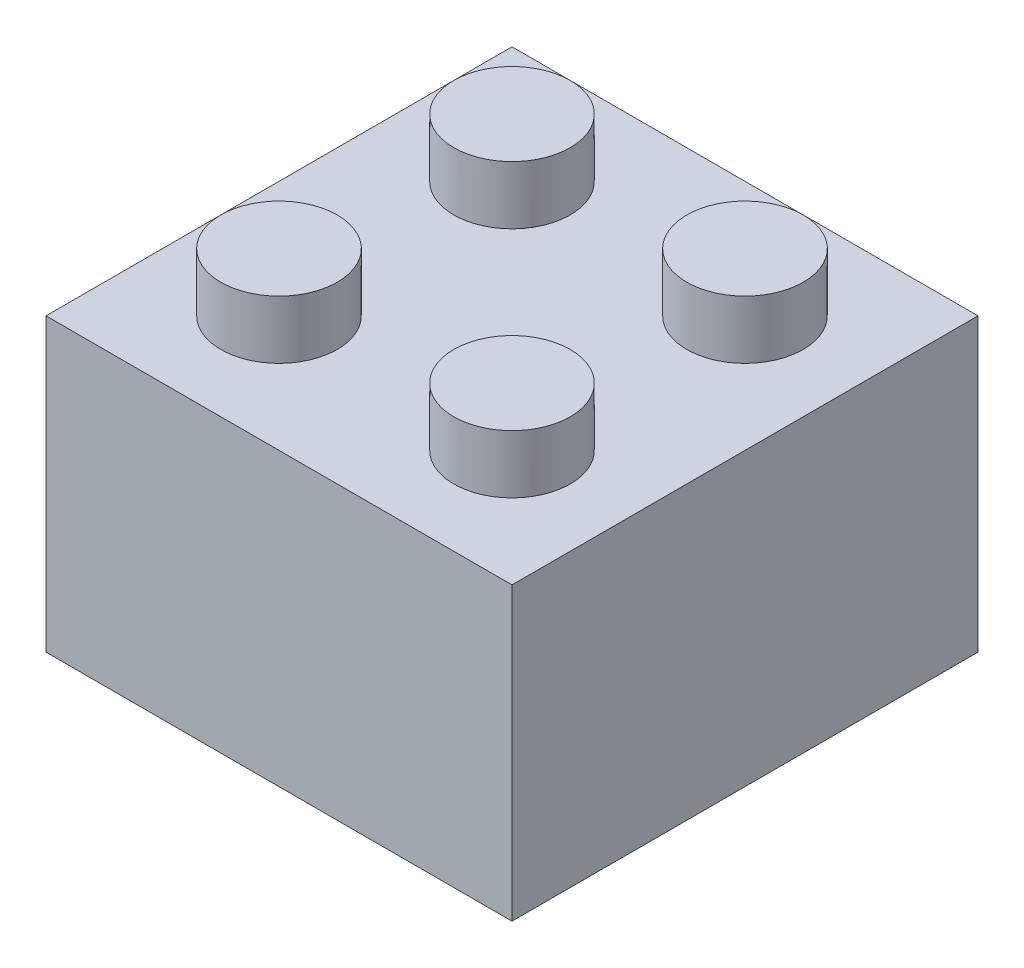
ISO-10303-21;
HEADER;
FILE_DESCRIPTION(('STEP AP214'),'2;1');
FILE_NAME('part.step','',(''),(''),'','','');
FILE_SCHEMA(('AUTOMOTIVE_DESIGN { 1 0 10303 214 1 1 1 1 }'));
ENDSEC;
DATA;
#1=APPLICATION_CONTEXT('core data for automotive mechanical design processes');
#2=APPLICATION_PROTOCOL_DEFINITION('international standard','automotive_design',2000,#1);
#3=PRODUCT_CONTEXT('',#1,'mechanical');
#4=PRODUCT('Part','Part','',(#3));
#5=PRODUCT_RELATED_PRODUCT_CATEGORY('part','',(#4));
#6=PRODUCT_DEFINITION_FORMATION('','',#4);
#7=PRODUCT_DEFINITION_CONTEXT('part definition',#1,'design');
#8=PRODUCT_DEFINITION('design','',#6,#7);
#9=PRODUCT_DEFINITION_SHAPE('','',#8);
#10=(LENGTH_UNIT() NAMED_UNIT(*) SI_UNIT(.MILLI.,.METRE.));
#11=(NAMED_UNIT(*) PLANE_ANGLE_UNIT() SI_UNIT($,.RADIAN.));
#12=(NAMED_UNIT(*) SI_UNIT($,.STERADIAN.) SOLID_ANGLE_UNIT());
#13=UNCERTAINTY_MEASURE_WITH_UNIT(LENGTH_MEASURE(1.E-05),#10,'distance_accuracy_value','');
#14=(GEOMETRIC_REPRESENTATION_CONTEXT(3) GLOBAL_UNCERTAINTY_ASSIGNED_CONTEXT((#13)) GLOBAL_UNIT_ASSIGNED_CONTEXT((#10,
#11,#12)) REPRESENTATION_CONTEXT('',''));
#15=CARTESIAN_POINT('',(0.,0.,0.));
#16=DIRECTION('',(0.,0.,1.));
#17=DIRECTION('',(1.,0.,0.));
#18=AXIS2_PLACEMENT_3D('',#15,#16,#17);
#19=CARTESIAN_POINT('',(0.,0.,0.));
#20=DIRECTION('',(0.,-1.,0.));
#21=DIRECTION('',(0.,0.,-1.));
#22=AXIS2_PLACEMENT_3D('',#19,#20,#21);
#23=PLANE('',#22);
#24=DIRECTION('',(0.,0.,1.));
#25=VECTOR('',#24,1.);
#26=CARTESIAN_POINT('',(0.,0.,0.));
#27=LINE('',#26,#25);
#28=CARTESIAN_POINT('',(0.,0.,-16.));
#29=VERTEX_POINT('',#28);
#30=CARTESIAN_POINT('',(0.,0.,0.));
#31=VERTEX_POINT('',#30);
#32=EDGE_CURVE('E226',#29,#31,#27,.T.);
#33=ORIENTED_EDGE('',*,*,#32,.F.);
#34=DIRECTION('',(-1.,0.,0.));
#35=VECTOR('',#34,1.);
#36=CARTESIAN_POINT('',(0.,0.,-16.));
#37=LINE('',#36,#35);
#38=CARTESIAN_POINT('',(16.,0.,-16.));
#39=VERTEX_POINT('',#38);
#40=EDGE_CURVE('E93',#39,#29,#37,.T.);
#41=ORIENTED_EDGE('',*,*,#40,.F.);
#42=DIRECTION('',(0.,0.,-1.));
#43=VECTOR('',#42,1.);
#44=CARTESIAN_POINT('',(16.,0.,0.));
#45=LINE('',#44,#43);
#46=CARTESIAN_POINT('',(16.,0.,0.));
#47=VERTEX_POINT('',#46);
#48=EDGE_CURVE('E244',#47,#39,#45,.T.);
#49=ORIENTED_EDGE('',*,*,#48,.F.);
#50=DIRECTION('',(1.,0.,0.));
#51=VECTOR('',#50,1.);
#52=CARTESIAN_POINT('',(0.,0.,0.));
#53=LINE('',#52,#51);
#54=EDGE_CURVE('E241',#31,#47,#53,.T.);
#55=ORIENTED_EDGE('',*,*,#54,.F.);
#56=EDGE_LOOP('',(#33,#41,#49,#55));
#57=FACE_BOUND('',#56,.T.);
#58=DIRECTION('',(-1.,0.,0.));
#59=VECTOR('',#58,1.);
#60=CARTESIAN_POINT('',(0.,0.,-15.));
#61=LINE('',#60,#59);
#62=CARTESIAN_POINT('',(15.,0.,-15.));
#63=VERTEX_POINT('',#62);
#64=CARTESIAN_POINT('',(1.00000000000001,0.,-15.));
#65=VERTEX_POINT('',#64);
#66=EDGE_CURVE('E143',#63,#65,#61,.T.);
#67=ORIENTED_EDGE('',*,*,#66,.T.);
#68=DIRECTION('',(0.,0.,1.));
#69=VECTOR('',#68,1.);
#70=CARTESIAN_POINT('',(1.,0.,0.));
#71=LINE('',#70,#69);
#72=CARTESIAN_POINT('',(1.,0.,-1.));
#73=VERTEX_POINT('',#72);
#74=EDGE_CURVE('E188',#65,#73,#71,.T.);
#75=ORIENTED_EDGE('',*,*,#74,.T.);
#76=DIRECTION('',(1.,0.,0.));
#77=VECTOR('',#76,1.);
#78=CARTESIAN_POINT('',(0.,0.,-1.));
#79=LINE('',#78,#77);
#80=CARTESIAN_POINT('',(15.,0.,-1.));
#81=VERTEX_POINT('',#80);
#82=EDGE_CURVE('E147',#73,#81,#79,.T.);
#83=ORIENTED_EDGE('',*,*,#82,.T.);
#84=DIRECTION('',(0.,0.,-1.));
#85=VECTOR('',#84,1.);
#86=CARTESIAN_POINT('',(15.,0.,0.));
#87=LINE('',#86,#85);
#88=EDGE_CURVE('E63',#81,#63,#87,.T.);
#89=ORIENTED_EDGE('',*,*,#88,.T.);
#90=EDGE_LOOP('',(#67,#75,#83,#89));
#91=FACE_BOUND('',#90,.T.);
#92=ADVANCED_FACE('F47',(#57,#91),#23,.T.);
#93=CARTESIAN_POINT('',(0.,10.,0.));
#94=DIRECTION('',(1.,0.,0.));
#95=DIRECTION('',(0.,0.,-1.));
#96=AXIS2_PLACEMENT_3D('',#93,#94,#95);
#97=PLANE('',#96);
#98=ORIENTED_EDGE('',*,*,#32,.T.);
#99=DIRECTION('',(0.,-1.,0.));
#100=VECTOR('',#99,1.);
#101=CARTESIAN_POINT('',(0.,10.,0.));
#102=LINE('',#101,#100);
#103=CARTESIAN_POINT('',(0.,10.,0.));
#104=VERTEX_POINT('',#103);
#105=EDGE_CURVE('E258',#104,#31,#102,.T.);
#106=ORIENTED_EDGE('',*,*,#105,.F.);
#107=DIRECTION('',(0.,0.,1.));
#108=VECTOR('',#107,1.);
#109=CARTESIAN_POINT('',(0.,10.,0.));
#110=LINE('',#109,#108);
#111=CARTESIAN_POINT('',(0.,10.,-16.));
#112=VERTEX_POINT('',#111);
#113=EDGE_CURVE('E227',#112,#104,#110,.T.);
#114=ORIENTED_EDGE('',*,*,#113,.F.);
#115=DIRECTION('',(0.,-1.,0.));
#116=VECTOR('',#115,1.);
#117=CARTESIAN_POINT('',(0.,10.,-16.));
#118=LINE('',#117,#116);
#119=EDGE_CURVE('E237',#112,#29,#118,.T.);
#120=ORIENTED_EDGE('',*,*,#119,.T.);
#121=EDGE_LOOP('',(#98,#106,#114,#120));
#122=FACE_BOUND('',#121,.T.);
#123=ADVANCED_FACE('F49',(#122),#97,.F.);
#124=CARTESIAN_POINT('',(0.,10.,0.));
#125=DIRECTION('',(0.,0.,-1.));
#126=DIRECTION('',(-1.,0.,0.));
#127=AXIS2_PLACEMENT_3D('',#124,#125,#126);
#128=PLANE('',#127);
#129=ORIENTED_EDGE('',*,*,#54,.T.);
#130=DIRECTION('',(0.,-1.,0.));
#131=VECTOR('',#130,1.);
#132=CARTESIAN_POINT('',(16.,10.,0.));
#133=LINE('',#132,#131);
#134=CARTESIAN_POINT('',(16.,10.,0.));
#135=VERTEX_POINT('',#134);
#136=EDGE_CURVE('E254',#135,#47,#133,.T.);
#137=ORIENTED_EDGE('',*,*,#136,.F.);
#138=DIRECTION('',(1.,0.,0.));
#139=VECTOR('',#138,1.);
#140=CARTESIAN_POINT('',(0.,10.,0.));
#141=LINE('',#140,#139);
#142=EDGE_CURVE('E101',#104,#135,#141,.T.);
#143=ORIENTED_EDGE('',*,*,#142,.F.);
#144=ORIENTED_EDGE('',*,*,#105,.T.);
#145=EDGE_LOOP('',(#129,#137,#143,#144));
#146=FACE_BOUND('',#145,.T.);
#147=ADVANCED_FACE('F293',(#146),#128,.F.);
#148=CARTESIAN_POINT('',(16.,10.,0.));
#149=DIRECTION('',(-1.,0.,0.));
#150=DIRECTION('',(0.,0.,1.));
#151=AXIS2_PLACEMENT_3D('',#148,#149,#150);
#152=PLANE('',#151);
#153=ORIENTED_EDGE('',*,*,#48,.T.);
#154=DIRECTION('',(0.,-1.,0.));
#155=VECTOR('',#154,1.);
#156=CARTESIAN_POINT('',(16.,10.,-16.));
#157=LINE('',#156,#155);
#158=CARTESIAN_POINT('',(16.,10.,-16.));
#159=VERTEX_POINT('',#158);
#160=EDGE_CURVE('E251',#159,#39,#157,.T.);
#161=ORIENTED_EDGE('',*,*,#160,.F.);
#162=DIRECTION('',(0.,0.,-1.));
#163=VECTOR('',#162,1.);
#164=CARTESIAN_POINT('',(16.,10.,0.));
#165=LINE('',#164,#163);
#166=EDGE_CURVE('E232',#135,#159,#165,.T.);
#167=ORIENTED_EDGE('',*,*,#166,.F.);
#168=ORIENTED_EDGE('',*,*,#136,.T.);
#169=EDGE_LOOP('',(#153,#161,#167,#168));
#170=FACE_BOUND('',#169,.T.);
#171=ADVANCED_FACE('F298',(#170),#152,.F.);
#172=CARTESIAN_POINT('',(0.,10.,-16.));
#173=DIRECTION('',(0.,0.,1.));
#174=DIRECTION('',(1.,0.,0.));
#175=AXIS2_PLACEMENT_3D('',#172,#173,#174);
#176=PLANE('',#175);
#177=ORIENTED_EDGE('',*,*,#40,.T.);
#178=ORIENTED_EDGE('',*,*,#119,.F.);
#179=DIRECTION('',(-1.,0.,0.));
#180=VECTOR('',#179,1.);
#181=CARTESIAN_POINT('',(0.,10.,-16.));
#182=LINE('',#181,#180);
#183=EDGE_CURVE('E72',#159,#112,#182,.T.);
#184=ORIENTED_EDGE('',*,*,#183,.F.);
#185=ORIENTED_EDGE('',*,*,#160,.T.);
#186=EDGE_LOOP('',(#177,#178,#184,#185));
#187=FACE_BOUND('',#186,.T.);
#188=ADVANCED_FACE('F282',(#187),#176,.F.);
#189=CARTESIAN_POINT('',(0.,10.,0.));
#190=DIRECTION('',(0.,-1.,0.));
#191=DIRECTION('',(0.,0.,-1.));
#192=AXIS2_PLACEMENT_3D('',#189,#190,#191);
#193=PLANE('',#192);
#194=CARTESIAN_POINT('',(4.00000000000001,10.,-4.));
#195=DIRECTION('',(0.,-1.,0.));
#196=DIRECTION('',(0.,0.,-1.));
#197=AXIS2_PLACEMENT_3D('',#194,#195,#196);
#198=CIRCLE('',#197,2.);
#199=CARTESIAN_POINT('',(4.00000000000001,10.,-6.));
#200=VERTEX_POINT('',#199);
#201=EDGE_CURVE('E56',#200,#200,#198,.F.);
#202=ORIENTED_EDGE('',*,*,#201,.F.);
#203=EDGE_LOOP('',(#202));
#204=FACE_BOUND('',#203,.T.);
#205=CARTESIAN_POINT('',(4.00000000000001,10.,-12.));
#206=DIRECTION('',(0.,-1.,0.));
#207=DIRECTION('',(0.,0.,-1.));
#208=AXIS2_PLACEMENT_3D('',#205,#206,#207);
#209=CIRCLE('',#208,2.);
#210=CARTESIAN_POINT('',(4.00000000000001,10.,-14.));
#211=VERTEX_POINT('',#210);
#212=EDGE_CURVE('E269',#211,#211,#209,.F.);
#213=ORIENTED_EDGE('',*,*,#212,.F.);
#214=EDGE_LOOP('',(#213));
#215=FACE_BOUND('',#214,.T.);
#216=CARTESIAN_POINT('',(12.,10.,-4.));
#217=DIRECTION('',(0.,-1.,0.));
#218=DIRECTION('',(0.,0.,-1.));
#219=AXIS2_PLACEMENT_3D('',#216,#217,#218);
#220=CIRCLE('',#219,2.);
#221=CARTESIAN_POINT('',(12.,10.,-6.00000000000001));
#222=VERTEX_POINT('',#221);
#223=EDGE_CURVE('E265',#222,#222,#220,.F.);
#224=ORIENTED_EDGE('',*,*,#223,.F.);
#225=EDGE_LOOP('',(#224));
#226=FACE_BOUND('',#225,.T.);
#227=CARTESIAN_POINT('',(12.,10.,-12.));
#228=DIRECTION('',(0.,-1.,0.));
#229=DIRECTION('',(0.,0.,-1.));
#230=AXIS2_PLACEMENT_3D('',#227,#228,#229);
#231=CIRCLE('',#230,2.);
#232=CARTESIAN_POINT('',(12.,10.,-14.));
#233=VERTEX_POINT('',#232);
#234=EDGE_CURVE('E261',#233,#233,#231,.F.);
#235=ORIENTED_EDGE('',*,*,#234,.F.);
#236=EDGE_LOOP('',(#235));
#237=FACE_BOUND('',#236,.T.);
#238=ORIENTED_EDGE('',*,*,#113,.T.);
#239=ORIENTED_EDGE('',*,*,#142,.T.);
#240=ORIENTED_EDGE('',*,*,#166,.T.);
#241=ORIENTED_EDGE('',*,*,#183,.T.);
#242=EDGE_LOOP('',(#238,#239,#240,#241));
#243=FACE_BOUND('',#242,.T.);
#244=ADVANCED_FACE('F278',(#204,#215,#226,#237,#243),#193,.F.);
#245=CARTESIAN_POINT('',(12.,12.,-12.));
#246=DIRECTION('',(0.,-1.,0.));
#247=DIRECTION('',(0.,0.,-1.));
#248=AXIS2_PLACEMENT_3D('',#245,#246,#247);
#249=CYLINDRICAL_SURFACE('',#248,2.);
#250=CARTESIAN_POINT('',(12.,12.,-12.));
#251=DIRECTION('',(0.,1.,0.));
#252=DIRECTION('',(0.,0.,-1.));
#253=AXIS2_PLACEMENT_3D('',#250,#251,#252);
#254=CIRCLE('',#253,2.);
#255=CARTESIAN_POINT('',(12.,12.,-14.));
#256=VERTEX_POINT('',#255);
#257=EDGE_CURVE('E222',#256,#256,#254,.T.);
#258=ORIENTED_EDGE('',*,*,#257,.F.);
#259=EDGE_LOOP('',(#258));
#260=FACE_BOUND('',#259,.T.);
#261=ORIENTED_EDGE('',*,*,#234,.T.);
#262=EDGE_LOOP('',(#261));
#263=FACE_BOUND('',#262,.T.);
#264=ADVANCED_FACE('F281',(#260,#263),#249,.T.);
#265=CARTESIAN_POINT('',(12.,12.,-12.));
#266=DIRECTION('',(0.,-1.,0.));
#267=DIRECTION('',(0.,0.,-1.));
#268=AXIS2_PLACEMENT_3D('',#265,#266,#267);
#269=PLANE('',#268);
#270=ORIENTED_EDGE('',*,*,#257,.T.);
#271=EDGE_LOOP('',(#270));
#272=FACE_BOUND('',#271,.T.);
#273=ADVANCED_FACE('F374',(#272),#269,.F.);
#274=CARTESIAN_POINT('',(12.,12.,-4.));
#275=DIRECTION('',(0.,-1.,0.));
#276=DIRECTION('',(0.,0.,-1.));
#277=AXIS2_PLACEMENT_3D('',#274,#275,#276);
#278=CYLINDRICAL_SURFACE('',#277,2.);
#279=CARTESIAN_POINT('',(12.,12.,-4.));
#280=DIRECTION('',(0.,1.,0.));
#281=DIRECTION('',(0.,0.,1.));
#282=AXIS2_PLACEMENT_3D('',#279,#280,#281);
#283=CIRCLE('',#282,2.);
#284=CARTESIAN_POINT('',(12.,12.,-2.));
#285=VERTEX_POINT('',#284);
#286=EDGE_CURVE('E218',#285,#285,#283,.T.);
#287=ORIENTED_EDGE('',*,*,#286,.F.);
#288=EDGE_LOOP('',(#287));
#289=FACE_BOUND('',#288,.T.);
#290=ORIENTED_EDGE('',*,*,#223,.T.);
#291=EDGE_LOOP('',(#290));
#292=FACE_BOUND('',#291,.T.);
#293=ADVANCED_FACE('F371',(#289,#292),#278,.T.);
#294=CARTESIAN_POINT('',(12.,12.,-4.));
#295=DIRECTION('',(0.,1.,0.));
#296=DIRECTION('',(0.,0.,1.));
#297=AXIS2_PLACEMENT_3D('',#294,#295,#296);
#298=PLANE('',#297);
#299=ORIENTED_EDGE('',*,*,#286,.T.);
#300=EDGE_LOOP('',(#299));
#301=FACE_BOUND('',#300,.T.);
#302=ADVANCED_FACE('F366',(#301),#298,.T.);
#303=CARTESIAN_POINT('',(4.00000000000001,12.,-12.));
#304=DIRECTION('',(0.,-1.,0.));
#305=DIRECTION('',(0.,0.,-1.));
#306=AXIS2_PLACEMENT_3D('',#303,#304,#305);
#307=CYLINDRICAL_SURFACE('',#306,2.);
#308=CARTESIAN_POINT('',(4.00000000000001,12.,-12.));
#309=DIRECTION('',(0.,1.,0.));
#310=DIRECTION('',(0.,0.,1.));
#311=AXIS2_PLACEMENT_3D('',#308,#309,#310);
#312=CIRCLE('',#311,2.);
#313=CARTESIAN_POINT('',(4.00000000000001,12.,-10.));
#314=VERTEX_POINT('',#313);
#315=EDGE_CURVE('E214',#314,#314,#312,.T.);
#316=ORIENTED_EDGE('',*,*,#315,.F.);
#317=EDGE_LOOP('',(#316));
#318=FACE_BOUND('',#317,.T.);
#319=ORIENTED_EDGE('',*,*,#212,.T.);
#320=EDGE_LOOP('',(#319));
#321=FACE_BOUND('',#320,.T.);
#322=ADVANCED_FACE('F363',(#318,#321),#307,.T.);
#323=CARTESIAN_POINT('',(4.00000000000001,12.,-12.));
#324=DIRECTION('',(0.,1.,0.));
#325=DIRECTION('',(0.,0.,1.));
#326=AXIS2_PLACEMENT_3D('',#323,#324,#325);
#327=PLANE('',#326);
#328=ORIENTED_EDGE('',*,*,#315,.T.);
#329=EDGE_LOOP('',(#328));
#330=FACE_BOUND('',#329,.T.);
#331=ADVANCED_FACE('F358',(#330),#327,.T.);
#332=CARTESIAN_POINT('',(4.00000000000001,12.,-4.));
#333=DIRECTION('',(0.,-1.,0.));
#334=DIRECTION('',(0.,0.,-1.));
#335=AXIS2_PLACEMENT_3D('',#332,#333,#334);
#336=CYLINDRICAL_SURFACE('',#335,2.);
#337=CARTESIAN_POINT('',(4.00000000000001,12.,-4.));
#338=DIRECTION('',(0.,1.,0.));
#339=DIRECTION('',(0.,0.,-1.));
#340=AXIS2_PLACEMENT_3D('',#337,#338,#339);
#341=CIRCLE('',#340,2.);
#342=CARTESIAN_POINT('',(4.00000000000001,12.,-6.));
#343=VERTEX_POINT('',#342);
#344=EDGE_CURVE('E176',#343,#343,#341,.T.);
#345=ORIENTED_EDGE('',*,*,#344,.F.);
#346=EDGE_LOOP('',(#345));
#347=FACE_BOUND('',#346,.T.);
#348=ORIENTED_EDGE('',*,*,#201,.T.);
#349=EDGE_LOOP('',(#348));
#350=FACE_BOUND('',#349,.T.);
#351=ADVANCED_FACE('F276',(#347,#350),#336,.T.);
#352=CARTESIAN_POINT('',(4.00000000000001,12.,-4.));
#353=DIRECTION('',(0.,-1.,0.));
#354=DIRECTION('',(0.,0.,-1.));
#355=AXIS2_PLACEMENT_3D('',#352,#353,#354);
#356=PLANE('',#355);
#357=ORIENTED_EDGE('',*,*,#344,.T.);
#358=EDGE_LOOP('',(#357));
#359=FACE_BOUND('',#358,.T.);
#360=ADVANCED_FACE('F357',(#359),#356,.F.);
#361=CARTESIAN_POINT('',(1.,10.,0.));
#362=DIRECTION('',(1.,0.,0.));
#363=DIRECTION('',(0.,0.,-1.));
#364=AXIS2_PLACEMENT_3D('',#361,#362,#363);
#365=PLANE('',#364);
#366=ORIENTED_EDGE('',*,*,#74,.F.);
#367=DIRECTION('',(0.,-1.,0.));
#368=VECTOR('',#367,1.);
#369=CARTESIAN_POINT('',(1.00000000000001,10.,-15.));
#370=LINE('',#369,#368);
#371=CARTESIAN_POINT('',(1.00000000000001,9.,-15.));
#372=VERTEX_POINT('',#371);
#373=EDGE_CURVE('E141',#372,#65,#370,.T.);
#374=ORIENTED_EDGE('',*,*,#373,.F.);
#375=DIRECTION('',(0.,0.,1.));
#376=VECTOR('',#375,1.);
#377=CARTESIAN_POINT('',(1.,9.,0.));
#378=LINE('',#377,#376);
#379=CARTESIAN_POINT('',(1.,9.,-1.));
#380=VERTEX_POINT('',#379);
#381=EDGE_CURVE('E128',#372,#380,#378,.T.);
#382=ORIENTED_EDGE('',*,*,#381,.T.);
#383=DIRECTION('',(0.,-1.,0.));
#384=VECTOR('',#383,1.);
#385=CARTESIAN_POINT('',(1.,10.,-1.));
#386=LINE('',#385,#384);
#387=EDGE_CURVE('E139',#380,#73,#386,.T.);
#388=ORIENTED_EDGE('',*,*,#387,.T.);
#389=EDGE_LOOP('',(#366,#374,#382,#388));
#390=FACE_BOUND('',#389,.T.);
#391=ADVANCED_FACE('F138',(#390),#365,.T.);
#392=CARTESIAN_POINT('',(0.,10.,-1.));
#393=DIRECTION('',(0.,0.,-1.));
#394=DIRECTION('',(-1.,0.,0.));
#395=AXIS2_PLACEMENT_3D('',#392,#393,#394);
#396=PLANE('',#395);
#397=ORIENTED_EDGE('',*,*,#82,.F.);
#398=ORIENTED_EDGE('',*,*,#387,.F.);
#399=DIRECTION('',(1.,0.,0.));
#400=VECTOR('',#399,1.);
#401=CARTESIAN_POINT('',(0.,9.,-1.));
#402=LINE('',#401,#400);
#403=CARTESIAN_POINT('',(15.,9.,-1.));
#404=VERTEX_POINT('',#403);
#405=EDGE_CURVE('E124',#380,#404,#402,.T.);
#406=ORIENTED_EDGE('',*,*,#405,.T.);
#407=DIRECTION('',(0.,-1.,0.));
#408=VECTOR('',#407,1.);
#409=CARTESIAN_POINT('',(15.,10.,-1.));
#410=LINE('',#409,#408);
#411=EDGE_CURVE('E150',#404,#81,#410,.T.);
#412=ORIENTED_EDGE('',*,*,#411,.T.);
#413=EDGE_LOOP('',(#397,#398,#406,#412));
#414=FACE_BOUND('',#413,.T.);
#415=ADVANCED_FACE('F145',(#414),#396,.T.);
#416=CARTESIAN_POINT('',(15.,10.,0.));
#417=DIRECTION('',(-1.,0.,0.));
#418=DIRECTION('',(0.,0.,1.));
#419=AXIS2_PLACEMENT_3D('',#416,#417,#418);
#420=PLANE('',#419);
#421=ORIENTED_EDGE('',*,*,#88,.F.);
#422=ORIENTED_EDGE('',*,*,#411,.F.);
#423=DIRECTION('',(0.,0.,-1.));
#424=VECTOR('',#423,1.);
#425=CARTESIAN_POINT('',(15.,9.,0.));
#426=LINE('',#425,#424);
#427=CARTESIAN_POINT('',(15.,9.,-15.));
#428=VERTEX_POINT('',#427);
#429=EDGE_CURVE('E129',#404,#428,#426,.T.);
#430=ORIENTED_EDGE('',*,*,#429,.T.);
#431=DIRECTION('',(0.,-1.,0.));
#432=VECTOR('',#431,1.);
#433=CARTESIAN_POINT('',(15.,10.,-15.));
#434=LINE('',#433,#432);
#435=EDGE_CURVE('E157',#428,#63,#434,.T.);
#436=ORIENTED_EDGE('',*,*,#435,.T.);
#437=EDGE_LOOP('',(#421,#422,#430,#436));
#438=FACE_BOUND('',#437,.T.);
#439=ADVANCED_FACE('F307',(#438),#420,.T.);
#440=CARTESIAN_POINT('',(0.,10.,-15.));
#441=DIRECTION('',(0.,0.,1.));
#442=DIRECTION('',(1.,0.,0.));
#443=AXIS2_PLACEMENT_3D('',#440,#441,#442);
#444=PLANE('',#443);
#445=ORIENTED_EDGE('',*,*,#66,.F.);
#446=ORIENTED_EDGE('',*,*,#435,.F.);
#447=DIRECTION('',(-1.,0.,0.));
#448=VECTOR('',#447,1.);
#449=CARTESIAN_POINT('',(0.,9.,-15.));
#450=LINE('',#449,#448);
#451=EDGE_CURVE('E164',#428,#372,#450,.T.);
#452=ORIENTED_EDGE('',*,*,#451,.T.);
#453=ORIENTED_EDGE('',*,*,#373,.T.);
#454=EDGE_LOOP('',(#445,#446,#452,#453));
#455=FACE_BOUND('',#454,.T.);
#456=ADVANCED_FACE('F306',(#455),#444,.T.);
#457=CARTESIAN_POINT('',(0.,9.,0.));
#458=DIRECTION('',(0.,-1.,0.));
#459=DIRECTION('',(0.,0.,-1.));
#460=AXIS2_PLACEMENT_3D('',#457,#458,#459);
#461=PLANE('',#460);
#462=CARTESIAN_POINT('',(8.00000000000001,9.,-8.00000000000001));
#463=DIRECTION('',(0.,-1.,0.));
#464=DIRECTION('',(0.,0.,-1.));
#465=AXIS2_PLACEMENT_3D('',#462,#463,#464);
#466=CIRCLE('',#465,2.7);
#467=CARTESIAN_POINT('',(8.00000000000001,9.,-10.7));
#468=VERTEX_POINT('',#467);
#469=EDGE_CURVE('E160',#468,#468,#466,.T.);
#470=ORIENTED_EDGE('',*,*,#469,.F.);
#471=EDGE_LOOP('',(#470));
#472=FACE_BOUND('',#471,.T.);
#473=CARTESIAN_POINT('',(4.00000000000001,9.,-4.));
#474=DIRECTION('',(0.,-1.,0.));
#475=DIRECTION('',(0.,0.,-1.));
#476=AXIS2_PLACEMENT_3D('',#473,#474,#475);
#477=CIRCLE('',#476,1.);
#478=CARTESIAN_POINT('',(4.00000000000001,9.,-5.));
#479=VERTEX_POINT('',#478);
#480=EDGE_CURVE('E172',#479,#479,#477,.F.);
#481=ORIENTED_EDGE('',*,*,#480,.T.);
#482=EDGE_LOOP('',(#481));
#483=FACE_BOUND('',#482,.T.);
#484=CARTESIAN_POINT('',(4.00000000000001,9.,-12.));
#485=DIRECTION('',(0.,-1.,0.));
#486=DIRECTION('',(0.,0.,-1.));
#487=AXIS2_PLACEMENT_3D('',#484,#485,#486);
#488=CIRCLE('',#487,1.);
#489=CARTESIAN_POINT('',(4.00000000000001,9.,-13.));
#490=VERTEX_POINT('',#489);
#491=EDGE_CURVE('E177',#490,#490,#488,.F.);
#492=ORIENTED_EDGE('',*,*,#491,.T.);
#493=EDGE_LOOP('',(#492));
#494=FACE_BOUND('',#493,.T.);
#495=CARTESIAN_POINT('',(12.,9.,-4.));
#496=DIRECTION('',(0.,-1.,0.));
#497=DIRECTION('',(0.,0.,-1.));
#498=AXIS2_PLACEMENT_3D('',#495,#496,#497);
#499=CIRCLE('',#498,1.);
#500=CARTESIAN_POINT('',(12.,9.,-5.));
#501=VERTEX_POINT('',#500);
#502=EDGE_CURVE('E155',#501,#501,#499,.F.);
#503=ORIENTED_EDGE('',*,*,#502,.T.);
#504=EDGE_LOOP('',(#503));
#505=FACE_BOUND('',#504,.T.);
#506=CARTESIAN_POINT('',(12.,9.,-12.));
#507=DIRECTION('',(0.,-1.,0.));
#508=DIRECTION('',(0.,0.,-1.));
#509=AXIS2_PLACEMENT_3D('',#506,#507,#508);
#510=CIRCLE('',#509,1.);
#511=CARTESIAN_POINT('',(12.,9.,-13.));
#512=VERTEX_POINT('',#511);
#513=EDGE_CURVE('E149',#512,#512,#510,.F.);
#514=ORIENTED_EDGE('',*,*,#513,.T.);
#515=EDGE_LOOP('',(#514));
#516=FACE_BOUND('',#515,.T.);
#517=ORIENTED_EDGE('',*,*,#381,.F.);
#518=ORIENTED_EDGE('',*,*,#451,.F.);
#519=ORIENTED_EDGE('',*,*,#429,.F.);
#520=ORIENTED_EDGE('',*,*,#405,.F.);
#521=EDGE_LOOP('',(#517,#518,#519,#520));
#522=FACE_BOUND('',#521,.T.);
#523=ADVANCED_FACE('F126',(#472,#483,#494,#505,#516,#522),#461,.T.);
#524=CARTESIAN_POINT('',(12.,12.,-12.));
#525=DIRECTION('',(0.,-1.,0.));
#526=DIRECTION('',(0.,0.,-1.));
#527=AXIS2_PLACEMENT_3D('',#524,#525,#526);
#528=CYLINDRICAL_SURFACE('',#527,1.);
#529=CARTESIAN_POINT('',(12.,11.,-12.));
#530=DIRECTION('',(0.,-1.,0.));
#531=DIRECTION('',(0.,0.,-1.));
#532=AXIS2_PLACEMENT_3D('',#529,#530,#531);
#533=CIRCLE('',#532,1.);
#534=CARTESIAN_POINT('',(12.,11.,-13.));
#535=VERTEX_POINT('',#534);
#536=EDGE_CURVE('E184',#535,#535,#533,.F.);
#537=ORIENTED_EDGE('',*,*,#536,.T.);
#538=EDGE_LOOP('',(#537));
#539=FACE_BOUND('',#538,.T.);
#540=ORIENTED_EDGE('',*,*,#513,.F.);
#541=EDGE_LOOP('',(#540));
#542=FACE_BOUND('',#541,.T.);
#543=ADVANCED_FACE('F320',(#539,#542),#528,.F.);
#544=CARTESIAN_POINT('',(12.,11.,-12.));
#545=DIRECTION('',(0.,-1.,0.));
#546=DIRECTION('',(0.,0.,-1.));
#547=AXIS2_PLACEMENT_3D('',#544,#545,#546);
#548=PLANE('',#547);
#549=ORIENTED_EDGE('',*,*,#536,.F.);
#550=EDGE_LOOP('',(#549));
#551=FACE_BOUND('',#550,.T.);
#552=ADVANCED_FACE('F325',(#551),#548,.T.);
#553=CARTESIAN_POINT('',(12.,12.,-4.));
#554=DIRECTION('',(0.,-1.,0.));
#555=DIRECTION('',(0.,0.,-1.));
#556=AXIS2_PLACEMENT_3D('',#553,#554,#555);
#557=CYLINDRICAL_SURFACE('',#556,1.);
#558=CARTESIAN_POINT('',(12.,11.,-4.));
#559=DIRECTION('',(0.,1.,0.));
#560=DIRECTION('',(0.,0.,1.));
#561=AXIS2_PLACEMENT_3D('',#558,#559,#560);
#562=CIRCLE('',#561,1.);
#563=CARTESIAN_POINT('',(12.,11.,-3.));
#564=VERTEX_POINT('',#563);
#565=EDGE_CURVE('E189',#564,#564,#562,.T.);
#566=ORIENTED_EDGE('',*,*,#565,.T.);
#567=EDGE_LOOP('',(#566));
#568=FACE_BOUND('',#567,.T.);
#569=ORIENTED_EDGE('',*,*,#502,.F.);
#570=EDGE_LOOP('',(#569));
#571=FACE_BOUND('',#570,.T.);
#572=ADVANCED_FACE('F329',(#568,#571),#557,.F.);
#573=CARTESIAN_POINT('',(12.,11.,-4.));
#574=DIRECTION('',(0.,1.,0.));
#575=DIRECTION('',(0.,0.,1.));
#576=AXIS2_PLACEMENT_3D('',#573,#574,#575);
#577=PLANE('',#576);
#578=ORIENTED_EDGE('',*,*,#565,.F.);
#579=EDGE_LOOP('',(#578));
#580=FACE_BOUND('',#579,.T.);
#581=ADVANCED_FACE('F333',(#580),#577,.F.);
#582=CARTESIAN_POINT('',(4.00000000000001,12.,-12.));
#583=DIRECTION('',(0.,-1.,0.));
#584=DIRECTION('',(0.,0.,-1.));
#585=AXIS2_PLACEMENT_3D('',#582,#583,#584);
#586=CYLINDRICAL_SURFACE('',#585,1.);
#587=CARTESIAN_POINT('',(4.00000000000001,11.,-12.));
#588=DIRECTION('',(0.,1.,0.));
#589=DIRECTION('',(0.,0.,1.));
#590=AXIS2_PLACEMENT_3D('',#587,#588,#589);
#591=CIRCLE('',#590,1.);
#592=CARTESIAN_POINT('',(4.00000000000001,11.,-11.));
#593=VERTEX_POINT('',#592);
#594=EDGE_CURVE('E193',#593,#593,#591,.T.);
#595=ORIENTED_EDGE('',*,*,#594,.T.);
#596=EDGE_LOOP('',(#595));
#597=FACE_BOUND('',#596,.T.);
#598=ORIENTED_EDGE('',*,*,#491,.F.);
#599=EDGE_LOOP('',(#598));
#600=FACE_BOUND('',#599,.T.);
#601=ADVANCED_FACE('F337',(#597,#600),#586,.F.);
#602=CARTESIAN_POINT('',(4.00000000000001,11.,-12.));
#603=DIRECTION('',(0.,1.,0.));
#604=DIRECTION('',(0.,0.,1.));
#605=AXIS2_PLACEMENT_3D('',#602,#603,#604);
#606=PLANE('',#605);
#607=ORIENTED_EDGE('',*,*,#594,.F.);
#608=EDGE_LOOP('',(#607));
#609=FACE_BOUND('',#608,.T.);
#610=ADVANCED_FACE('F341',(#609),#606,.F.);
#611=CARTESIAN_POINT('',(4.00000000000001,12.,-4.));
#612=DIRECTION('',(0.,-1.,0.));
#613=DIRECTION('',(0.,0.,-1.));
#614=AXIS2_PLACEMENT_3D('',#611,#612,#613);
#615=CYLINDRICAL_SURFACE('',#614,1.);
#616=CARTESIAN_POINT('',(4.00000000000001,11.,-4.));
#617=DIRECTION('',(0.,-1.,0.));
#618=DIRECTION('',(0.,0.,-1.));
#619=AXIS2_PLACEMENT_3D('',#616,#617,#618);
#620=CIRCLE('',#619,1.);
#621=CARTESIAN_POINT('',(4.00000000000001,11.,-5.));
#622=VERTEX_POINT('',#621);
#623=EDGE_CURVE('E197',#622,#622,#620,.F.);
#624=ORIENTED_EDGE('',*,*,#623,.T.);
#625=EDGE_LOOP('',(#624));
#626=FACE_BOUND('',#625,.T.);
#627=ORIENTED_EDGE('',*,*,#480,.F.);
#628=EDGE_LOOP('',(#627));
#629=FACE_BOUND('',#628,.T.);
#630=ADVANCED_FACE('F345',(#626,#629),#615,.F.);
#631=CARTESIAN_POINT('',(4.00000000000001,11.,-4.));
#632=DIRECTION('',(0.,-1.,0.));
#633=DIRECTION('',(0.,0.,-1.));
#634=AXIS2_PLACEMENT_3D('',#631,#632,#633);
#635=PLANE('',#634);
#636=ORIENTED_EDGE('',*,*,#623,.F.);
#637=EDGE_LOOP('',(#636));
#638=FACE_BOUND('',#637,.T.);
#639=ADVANCED_FACE('F349',(#638),#635,.T.);
#640=CARTESIAN_POINT('',(8.00000000000001,0.,-8.00000000000001));
#641=DIRECTION('',(0.,-1.,0.));
#642=DIRECTION('',(0.,0.,-1.));
#643=AXIS2_PLACEMENT_3D('',#640,#641,#642);
#644=PLANE('',#643);
#645=CARTESIAN_POINT('',(8.00000000000001,0.,-8.00000000000001));
#646=DIRECTION('',(0.,-1.,0.));
#647=DIRECTION('',(0.,0.,-1.));
#648=AXIS2_PLACEMENT_3D('',#645,#646,#647);
#649=CIRCLE('',#648,2.7);
#650=CARTESIAN_POINT('',(8.00000000000001,0.,-10.7));
#651=VERTEX_POINT('',#650);
#652=EDGE_CURVE('E201',#651,#651,#649,.T.);
#653=ORIENTED_EDGE('',*,*,#652,.T.);
#654=EDGE_LOOP('',(#653));
#655=FACE_BOUND('',#654,.T.);
#656=CARTESIAN_POINT('',(8.00000000000001,0.,-8.00000000000001));
#657=DIRECTION('',(0.,-1.,0.));
#658=DIRECTION('',(0.,0.,-1.));
#659=AXIS2_PLACEMENT_3D('',#656,#657,#658);
#660=CIRCLE('',#659,1.7);
#661=CARTESIAN_POINT('',(8.00000000000001,0.,-9.70000000000001));
#662=VERTEX_POINT('',#661);
#663=EDGE_CURVE('E590',#662,#662,#660,.T.);
#664=ORIENTED_EDGE('',*,*,#663,.F.);
#665=EDGE_LOOP('',(#664));
#666=FACE_BOUND('',#665,.T.);
#667=ADVANCED_FACE('F353',(#655,#666),#644,.T.);
#668=CARTESIAN_POINT('',(8.00000000000001,0.,-8.00000000000001));
#669=DIRECTION('',(0.,1.,0.));
#670=DIRECTION('',(0.,0.,1.));
#671=AXIS2_PLACEMENT_3D('',#668,#669,#670);
#672=CYLINDRICAL_SURFACE('',#671,2.7);
#673=ORIENTED_EDGE('',*,*,#652,.F.);
#674=EDGE_LOOP('',(#673));
#675=FACE_BOUND('',#674,.T.);
#676=ORIENTED_EDGE('',*,*,#469,.T.);
#677=EDGE_LOOP('',(#676));
#678=FACE_BOUND('',#677,.T.);
#679=ADVANCED_FACE('F564',(#675,#678),#672,.T.);
#680=CARTESIAN_POINT('',(8.00000000000001,0.,-8.00000000000001));
#681=DIRECTION('',(0.,1.,0.));
#682=DIRECTION('',(0.,0.,1.));
#683=AXIS2_PLACEMENT_3D('',#680,#681,#682);
#684=CYLINDRICAL_SURFACE('',#683,1.7);
#685=ORIENTED_EDGE('',*,*,#663,.T.);
#686=EDGE_LOOP('',(#685));
#687=FACE_BOUND('',#686,.T.);
#688=CARTESIAN_POINT('',(8.00000000000001,9.,-8.00000000000001));
#689=DIRECTION('',(0.,-1.,0.));
#690=DIRECTION('',(0.,0.,-1.));
#691=AXIS2_PLACEMENT_3D('',#688,#689,#690);
#692=CIRCLE('',#691,1.7);
#693=CARTESIAN_POINT('',(8.00000000000001,9.,-9.70000000000001));
#694=VERTEX_POINT('',#693);
#695=EDGE_CURVE('E11',#694,#694,#692,.F.);
#696=ORIENTED_EDGE('',*,*,#695,.T.);
#697=EDGE_LOOP('',(#696));
#698=FACE_BOUND('',#697,.T.);
#699=ADVANCED_FACE('F557',(#687,#698),#684,.F.);
#700=ORIENTED_EDGE('',*,*,#695,.F.);
#701=EDGE_LOOP('',(#700));
#702=FACE_BOUND('',#701,.T.);
#703=ADVANCED_FACE('F322',(#702),#461,.T.);
#704=CLOSED_SHELL('',(#92,#123,#147,#171,#188,#244,#264,#273,#293,#302,#322,#331,#351,#360,#391,
#415,#439,#456,#523,#543,#552,#572,#581,#601,#610,#630,#639,#667,#679,#699,#703));
#705=MANIFOLD_SOLID_BREP('B2',#704);
#706=ADVANCED_BREP_SHAPE_REPRESENTATION('',(#18,#705),#14);
#707=SHAPE_DEFINITION_REPRESENTATION(#9,#706);
ENDSEC;
END-ISO-10303-21;
